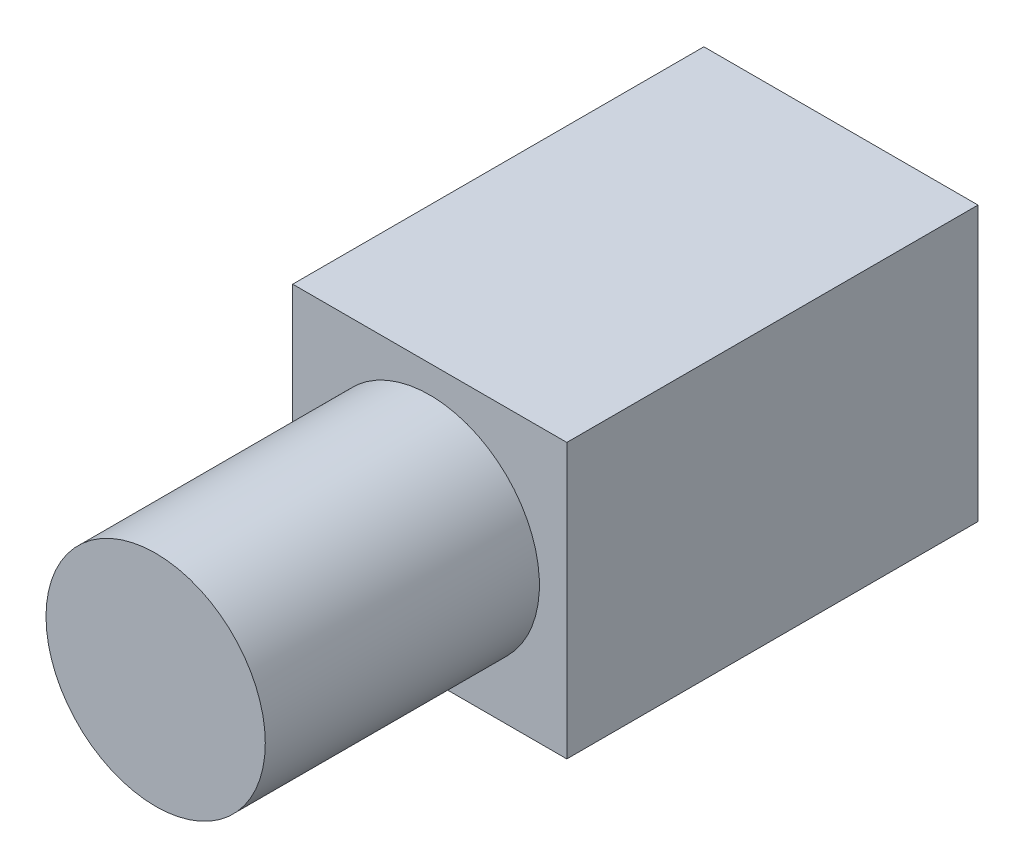
ISO-10303-21;
HEADER;
FILE_DESCRIPTION(('STEP AP214'),'2;1');
FILE_NAME('part.step','',(''),(''),'','','');
FILE_SCHEMA(('AUTOMOTIVE_DESIGN { 1 0 10303 214 1 1 1 1 }'));
ENDSEC;
DATA;
#1=APPLICATION_CONTEXT('core data for automotive mechanical design processes');
#2=APPLICATION_PROTOCOL_DEFINITION('international standard','automotive_design',2000,#1);
#3=PRODUCT_CONTEXT('',#1,'mechanical');
#4=PRODUCT('Part','Part','',(#3));
#5=PRODUCT_RELATED_PRODUCT_CATEGORY('part','',(#4));
#6=PRODUCT_DEFINITION_FORMATION('','',#4);
#7=PRODUCT_DEFINITION_CONTEXT('part definition',#1,'design');
#8=PRODUCT_DEFINITION('design','',#6,#7);
#9=PRODUCT_DEFINITION_SHAPE('','',#8);
#10=(LENGTH_UNIT() NAMED_UNIT(*) SI_UNIT(.MILLI.,.METRE.));
#11=(NAMED_UNIT(*) PLANE_ANGLE_UNIT() SI_UNIT($,.RADIAN.));
#12=(NAMED_UNIT(*) SI_UNIT($,.STERADIAN.) SOLID_ANGLE_UNIT());
#13=UNCERTAINTY_MEASURE_WITH_UNIT(LENGTH_MEASURE(1.E-05),#10,'distance_accuracy_value','');
#14=(GEOMETRIC_REPRESENTATION_CONTEXT(3) GLOBAL_UNCERTAINTY_ASSIGNED_CONTEXT((#13)) GLOBAL_UNIT_ASSIGNED_CONTEXT((#10,
#11,#12)) REPRESENTATION_CONTEXT('',''));
#15=CARTESIAN_POINT('',(0.,0.,0.));
#16=DIRECTION('',(0.,0.,1.));
#17=DIRECTION('',(1.,0.,0.));
#18=AXIS2_PLACEMENT_3D('',#15,#16,#17);
#19=CARTESIAN_POINT('',(0.,0.,15.));
#20=DIRECTION('',(1.,0.,0.));
#21=DIRECTION('',(0.,0.,-1.));
#22=AXIS2_PLACEMENT_3D('',#19,#20,#21);
#23=PLANE('',#22);
#24=DIRECTION('',(0.,-1.,0.));
#25=VECTOR('',#24,1.);
#26=CARTESIAN_POINT('',(0.,0.,0.));
#27=LINE('',#26,#25);
#28=CARTESIAN_POINT('',(0.,10.,0.));
#29=VERTEX_POINT('',#28);
#30=CARTESIAN_POINT('',(0.,0.,0.));
#31=VERTEX_POINT('',#30);
#32=EDGE_CURVE('E99',#29,#31,#27,.T.);
#33=ORIENTED_EDGE('',*,*,#32,.T.);
#34=DIRECTION('',(0.,0.,-1.));
#35=VECTOR('',#34,1.);
#36=CARTESIAN_POINT('',(0.,0.,15.));
#37=LINE('',#36,#35);
#38=CARTESIAN_POINT('',(0.,0.,15.));
#39=VERTEX_POINT('',#38);
#40=EDGE_CURVE('E41',#39,#31,#37,.T.);
#41=ORIENTED_EDGE('',*,*,#40,.F.);
#42=DIRECTION('',(0.,-1.,0.));
#43=VECTOR('',#42,1.);
#44=CARTESIAN_POINT('',(0.,0.,15.));
#45=LINE('',#44,#43);
#46=CARTESIAN_POINT('',(0.,10.,15.));
#47=VERTEX_POINT('',#46);
#48=EDGE_CURVE('E85',#47,#39,#45,.T.);
#49=ORIENTED_EDGE('',*,*,#48,.F.);
#50=DIRECTION('',(0.,0.,-1.));
#51=VECTOR('',#50,1.);
#52=CARTESIAN_POINT('',(0.,10.,15.));
#53=LINE('',#52,#51);
#54=EDGE_CURVE('E95',#47,#29,#53,.T.);
#55=ORIENTED_EDGE('',*,*,#54,.T.);
#56=EDGE_LOOP('',(#33,#41,#49,#55));
#57=FACE_BOUND('',#56,.T.);
#58=ADVANCED_FACE('F33',(#57),#23,.F.);
#59=CARTESIAN_POINT('',(0.,0.,15.));
#60=DIRECTION('',(0.,1.,0.));
#61=DIRECTION('',(0.,0.,1.));
#62=AXIS2_PLACEMENT_3D('',#59,#60,#61);
#63=PLANE('',#62);
#64=DIRECTION('',(1.,0.,0.));
#65=VECTOR('',#64,1.);
#66=CARTESIAN_POINT('',(0.,0.,0.));
#67=LINE('',#66,#65);
#68=CARTESIAN_POINT('',(10.,0.,0.));
#69=VERTEX_POINT('',#68);
#70=EDGE_CURVE('E90',#31,#69,#67,.T.);
#71=ORIENTED_EDGE('',*,*,#70,.T.);
#72=DIRECTION('',(0.,0.,-1.));
#73=VECTOR('',#72,1.);
#74=CARTESIAN_POINT('',(10.,0.,15.));
#75=LINE('',#74,#73);
#76=CARTESIAN_POINT('',(10.,0.,15.));
#77=VERTEX_POINT('',#76);
#78=EDGE_CURVE('E88',#77,#69,#75,.T.);
#79=ORIENTED_EDGE('',*,*,#78,.F.);
#80=DIRECTION('',(1.,0.,0.));
#81=VECTOR('',#80,1.);
#82=CARTESIAN_POINT('',(0.,0.,15.));
#83=LINE('',#82,#81);
#84=EDGE_CURVE('E80',#39,#77,#83,.T.);
#85=ORIENTED_EDGE('',*,*,#84,.F.);
#86=ORIENTED_EDGE('',*,*,#40,.T.);
#87=EDGE_LOOP('',(#71,#79,#85,#86));
#88=FACE_BOUND('',#87,.T.);
#89=ADVANCED_FACE('F89',(#88),#63,.F.);
#90=CARTESIAN_POINT('',(10.,0.,15.));
#91=DIRECTION('',(-1.,0.,0.));
#92=DIRECTION('',(0.,0.,1.));
#93=AXIS2_PLACEMENT_3D('',#90,#91,#92);
#94=PLANE('',#93);
#95=DIRECTION('',(0.,1.,0.));
#96=VECTOR('',#95,1.);
#97=CARTESIAN_POINT('',(10.,0.,0.));
#98=LINE('',#97,#96);
#99=CARTESIAN_POINT('',(10.,10.,0.));
#100=VERTEX_POINT('',#99);
#101=EDGE_CURVE('E66',#69,#100,#98,.T.);
#102=ORIENTED_EDGE('',*,*,#101,.T.);
#103=DIRECTION('',(0.,0.,-1.));
#104=VECTOR('',#103,1.);
#105=CARTESIAN_POINT('',(10.,10.,15.));
#106=LINE('',#105,#104);
#107=CARTESIAN_POINT('',(10.,10.,15.));
#108=VERTEX_POINT('',#107);
#109=EDGE_CURVE('E91',#108,#100,#106,.T.);
#110=ORIENTED_EDGE('',*,*,#109,.F.);
#111=DIRECTION('',(0.,1.,0.));
#112=VECTOR('',#111,1.);
#113=CARTESIAN_POINT('',(10.,0.,15.));
#114=LINE('',#113,#112);
#115=EDGE_CURVE('E83',#77,#108,#114,.T.);
#116=ORIENTED_EDGE('',*,*,#115,.F.);
#117=ORIENTED_EDGE('',*,*,#78,.T.);
#118=EDGE_LOOP('',(#102,#110,#116,#117));
#119=FACE_BOUND('',#118,.T.);
#120=ADVANCED_FACE('F93',(#119),#94,.F.);
#121=CARTESIAN_POINT('',(0.,10.,15.));
#122=DIRECTION('',(0.,-1.,0.));
#123=DIRECTION('',(0.,0.,-1.));
#124=AXIS2_PLACEMENT_3D('',#121,#122,#123);
#125=PLANE('',#124);
#126=DIRECTION('',(-1.,0.,0.));
#127=VECTOR('',#126,1.);
#128=CARTESIAN_POINT('',(0.,10.,0.));
#129=LINE('',#128,#127);
#130=EDGE_CURVE('E72',#100,#29,#129,.T.);
#131=ORIENTED_EDGE('',*,*,#130,.T.);
#132=ORIENTED_EDGE('',*,*,#54,.F.);
#133=DIRECTION('',(-1.,0.,0.));
#134=VECTOR('',#133,1.);
#135=CARTESIAN_POINT('',(0.,10.,15.));
#136=LINE('',#135,#134);
#137=EDGE_CURVE('E49',#108,#47,#136,.T.);
#138=ORIENTED_EDGE('',*,*,#137,.F.);
#139=ORIENTED_EDGE('',*,*,#109,.T.);
#140=EDGE_LOOP('',(#131,#132,#138,#139));
#141=FACE_BOUND('',#140,.T.);
#142=ADVANCED_FACE('F121',(#141),#125,.F.);
#143=CARTESIAN_POINT('',(0.,0.,15.));
#144=DIRECTION('',(0.,0.,-1.));
#145=DIRECTION('',(-1.,0.,0.));
#146=AXIS2_PLACEMENT_3D('',#143,#144,#145);
#147=PLANE('',#146);
#148=CARTESIAN_POINT('',(5.,5.,15.));
#149=DIRECTION('',(0.,0.,-1.));
#150=DIRECTION('',(-1.,0.,0.));
#151=AXIS2_PLACEMENT_3D('',#148,#149,#150);
#152=CIRCLE('',#151,4.);
#153=CARTESIAN_POINT('',(0.999999999999998,5.,15.));
#154=VERTEX_POINT('',#153);
#155=EDGE_CURVE('E11',#154,#154,#152,.F.);
#156=ORIENTED_EDGE('',*,*,#155,.F.);
#157=EDGE_LOOP('',(#156));
#158=FACE_BOUND('',#157,.T.);
#159=ORIENTED_EDGE('',*,*,#48,.T.);
#160=ORIENTED_EDGE('',*,*,#84,.T.);
#161=ORIENTED_EDGE('',*,*,#115,.T.);
#162=ORIENTED_EDGE('',*,*,#137,.T.);
#163=EDGE_LOOP('',(#159,#160,#161,#162));
#164=FACE_BOUND('',#163,.T.);
#165=ADVANCED_FACE('F81',(#158,#164),#147,.F.);
#166=CARTESIAN_POINT('',(0.,0.,0.));
#167=DIRECTION('',(0.,0.,-1.));
#168=DIRECTION('',(-1.,0.,0.));
#169=AXIS2_PLACEMENT_3D('',#166,#167,#168);
#170=PLANE('',#169);
#171=ORIENTED_EDGE('',*,*,#32,.F.);
#172=ORIENTED_EDGE('',*,*,#130,.F.);
#173=ORIENTED_EDGE('',*,*,#101,.F.);
#174=ORIENTED_EDGE('',*,*,#70,.F.);
#175=EDGE_LOOP('',(#171,#172,#173,#174));
#176=FACE_BOUND('',#175,.T.);
#177=ADVANCED_FACE('F110',(#176),#170,.T.);
#178=CARTESIAN_POINT('',(5.,5.,25.));
#179=DIRECTION('',(0.,0.,-1.));
#180=DIRECTION('',(-1.,0.,0.));
#181=AXIS2_PLACEMENT_3D('',#178,#179,#180);
#182=CYLINDRICAL_SURFACE('',#181,4.);
#183=CARTESIAN_POINT('',(5.,5.,25.));
#184=DIRECTION('',(0.,0.,1.));
#185=DIRECTION('',(1.,0.,0.));
#186=AXIS2_PLACEMENT_3D('',#183,#184,#185);
#187=CIRCLE('',#186,4.);
#188=CARTESIAN_POINT('',(9.,5.,25.));
#189=VERTEX_POINT('',#188);
#190=EDGE_CURVE('E102',#189,#189,#187,.T.);
#191=ORIENTED_EDGE('',*,*,#190,.F.);
#192=EDGE_LOOP('',(#191));
#193=FACE_BOUND('',#192,.T.);
#194=ORIENTED_EDGE('',*,*,#155,.T.);
#195=EDGE_LOOP('',(#194));
#196=FACE_BOUND('',#195,.T.);
#197=ADVANCED_FACE('F112',(#193,#196),#182,.T.);
#198=CARTESIAN_POINT('',(5.,5.,25.));
#199=DIRECTION('',(0.,0.,1.));
#200=DIRECTION('',(1.,0.,0.));
#201=AXIS2_PLACEMENT_3D('',#198,#199,#200);
#202=PLANE('',#201);
#203=ORIENTED_EDGE('',*,*,#190,.T.);
#204=EDGE_LOOP('',(#203));
#205=FACE_BOUND('',#204,.T.);
#206=ADVANCED_FACE('F118',(#205),#202,.T.);
#207=CLOSED_SHELL('',(#58,#89,#120,#142,#165,#177,#197,#206));
#208=MANIFOLD_SOLID_BREP('B2',#207);
#209=ADVANCED_BREP_SHAPE_REPRESENTATION('',(#18,#208),#14);
#210=SHAPE_DEFINITION_REPRESENTATION(#9,#209);
ENDSEC;
END-ISO-10303-21;
